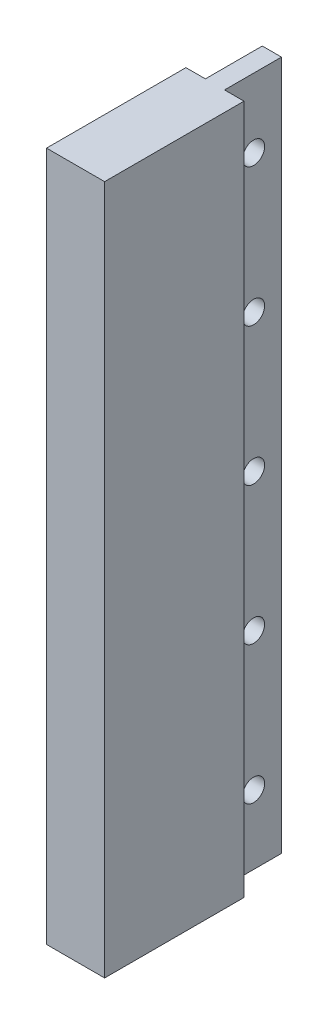
ISO-10303-21;
HEADER;
FILE_DESCRIPTION(('STEP AP214'),'2;1');
FILE_NAME('part.step','',(''),(''),'','','');
FILE_SCHEMA(('AUTOMOTIVE_DESIGN { 1 0 10303 214 1 1 1 1 }'));
ENDSEC;
DATA;
#1=APPLICATION_CONTEXT('core data for automotive mechanical design processes');
#2=APPLICATION_PROTOCOL_DEFINITION('international standard','automotive_design',2000,#1);
#3=PRODUCT_CONTEXT('',#1,'mechanical');
#4=PRODUCT('Part','Part','',(#3));
#5=PRODUCT_RELATED_PRODUCT_CATEGORY('part','',(#4));
#6=PRODUCT_DEFINITION_FORMATION('','',#4);
#7=PRODUCT_DEFINITION_CONTEXT('part definition',#1,'design');
#8=PRODUCT_DEFINITION('design','',#6,#7);
#9=PRODUCT_DEFINITION_SHAPE('','',#8);
#10=(LENGTH_UNIT() NAMED_UNIT(*) SI_UNIT(.MILLI.,.METRE.));
#11=(NAMED_UNIT(*) PLANE_ANGLE_UNIT() SI_UNIT($,.RADIAN.));
#12=(NAMED_UNIT(*) SI_UNIT($,.STERADIAN.) SOLID_ANGLE_UNIT());
#13=UNCERTAINTY_MEASURE_WITH_UNIT(LENGTH_MEASURE(1.E-05),#10,'distance_accuracy_value','');
#14=(GEOMETRIC_REPRESENTATION_CONTEXT(3) GLOBAL_UNCERTAINTY_ASSIGNED_CONTEXT((#13)) GLOBAL_UNIT_ASSIGNED_CONTEXT((#10,
#11,#12)) REPRESENTATION_CONTEXT('',''));
#15=CARTESIAN_POINT('',(0.,0.,0.));
#16=DIRECTION('',(0.,0.,1.));
#17=DIRECTION('',(1.,0.,0.));
#18=AXIS2_PLACEMENT_3D('',#15,#16,#17);
#19=CARTESIAN_POINT('',(0.00100000000000013,11.875,-5.00000000000001));
#20=DIRECTION('',(-1.,0.,0.));
#21=DIRECTION('',(0.,0.,1.));
#22=AXIS2_PLACEMENT_3D('',#19,#20,#21);
#23=CYLINDRICAL_SURFACE('',#22,1.9);
#24=CARTESIAN_POINT('',(-6.65,11.875,-5.00000000000001));
#25=DIRECTION('',(-1.,0.,0.));
#26=DIRECTION('',(0.,0.,1.));
#27=AXIS2_PLACEMENT_3D('',#24,#25,#26);
#28=CIRCLE('',#27,1.9);
#29=CARTESIAN_POINT('',(-6.65,11.875,-3.10000000000001));
#30=VERTEX_POINT('',#29);
#31=EDGE_CURVE('E55',#30,#30,#28,.T.);
#32=CARTESIAN_POINT('',(-3.35,11.875,-5.00000000000001));
#33=DIRECTION('',(-1.,0.,0.));
#34=DIRECTION('',(0.,0.,1.));
#35=AXIS2_PLACEMENT_3D('',#32,#33,#34);
#36=CIRCLE('',#35,1.9);
#37=CARTESIAN_POINT('',(-3.35,11.875,-3.10000000000001));
#38=VERTEX_POINT('',#37);
#39=EDGE_CURVE('E11',#38,#38,#36,.F.);
#40=CARTESIAN_POINT('',(-6.65,11.875,-3.10000000000001));
#41=CARTESIAN_POINT('',(-6.615625,11.875,-3.10000000000001));
#42=CARTESIAN_POINT('',(-6.58125,11.875,-3.10000000000001));
#43=CARTESIAN_POINT('',(-6.5125,11.875,-3.10000000000001));
#44=CARTESIAN_POINT('',(-6.478125,11.875,-3.10000000000001));
#45=CARTESIAN_POINT('',(-6.409375,11.875,-3.10000000000001));
#46=CARTESIAN_POINT('',(-6.375,11.875,-3.10000000000001));
#47=CARTESIAN_POINT('',(-6.30625,11.875,-3.10000000000001));
#48=CARTESIAN_POINT('',(-6.271875,11.875,-3.10000000000001));
#49=CARTESIAN_POINT('',(-6.203125,11.875,-3.10000000000001));
#50=CARTESIAN_POINT('',(-6.16875,11.875,-3.10000000000001));
#51=CARTESIAN_POINT('',(-6.1,11.875,-3.10000000000001));
#52=CARTESIAN_POINT('',(-6.065625,11.875,-3.10000000000001));
#53=CARTESIAN_POINT('',(-5.996875,11.875,-3.10000000000001));
#54=CARTESIAN_POINT('',(-5.9625,11.875,-3.10000000000001));
#55=CARTESIAN_POINT('',(-5.89375,11.875,-3.10000000000001));
#56=CARTESIAN_POINT('',(-5.859375,11.875,-3.10000000000001));
#57=CARTESIAN_POINT('',(-5.790625,11.875,-3.10000000000001));
#58=CARTESIAN_POINT('',(-5.75625,11.875,-3.10000000000001));
#59=CARTESIAN_POINT('',(-5.6875,11.875,-3.10000000000001));
#60=CARTESIAN_POINT('',(-5.653125,11.875,-3.10000000000001));
#61=CARTESIAN_POINT('',(-5.584375,11.875,-3.10000000000001));
#62=CARTESIAN_POINT('',(-5.55,11.875,-3.10000000000001));
#63=CARTESIAN_POINT('',(-5.48125,11.875,-3.10000000000001));
#64=CARTESIAN_POINT('',(-5.446875,11.875,-3.10000000000001));
#65=CARTESIAN_POINT('',(-5.378125,11.875,-3.10000000000001));
#66=CARTESIAN_POINT('',(-5.34375,11.875,-3.10000000000001));
#67=CARTESIAN_POINT('',(-5.275,11.875,-3.10000000000001));
#68=CARTESIAN_POINT('',(-5.240625,11.875,-3.10000000000001));
#69=CARTESIAN_POINT('',(-5.171875,11.875,-3.10000000000001));
#70=CARTESIAN_POINT('',(-5.1375,11.875,-3.10000000000001));
#71=CARTESIAN_POINT('',(-5.06875,11.875,-3.10000000000001));
#72=CARTESIAN_POINT('',(-5.034375,11.875,-3.10000000000001));
#73=CARTESIAN_POINT('',(-4.965625,11.875,-3.10000000000001));
#74=CARTESIAN_POINT('',(-4.93125,11.875,-3.10000000000001));
#75=CARTESIAN_POINT('',(-4.8625,11.875,-3.10000000000001));
#76=CARTESIAN_POINT('',(-4.828125,11.875,-3.10000000000001));
#77=CARTESIAN_POINT('',(-4.759375,11.875,-3.10000000000001));
#78=CARTESIAN_POINT('',(-4.725,11.875,-3.10000000000001));
#79=CARTESIAN_POINT('',(-4.65625,11.875,-3.10000000000001));
#80=CARTESIAN_POINT('',(-4.621875,11.875,-3.10000000000001));
#81=CARTESIAN_POINT('',(-4.553125,11.875,-3.10000000000001));
#82=CARTESIAN_POINT('',(-4.51875,11.875,-3.10000000000001));
#83=CARTESIAN_POINT('',(-4.45,11.875,-3.10000000000001));
#84=CARTESIAN_POINT('',(-4.415625,11.875,-3.10000000000001));
#85=CARTESIAN_POINT('',(-4.346875,11.875,-3.10000000000001));
#86=CARTESIAN_POINT('',(-4.3125,11.875,-3.10000000000001));
#87=CARTESIAN_POINT('',(-4.24375,11.875,-3.10000000000001));
#88=CARTESIAN_POINT('',(-4.209375,11.875,-3.10000000000001));
#89=CARTESIAN_POINT('',(-4.140625,11.875,-3.10000000000001));
#90=CARTESIAN_POINT('',(-4.10625,11.875,-3.10000000000001));
#91=CARTESIAN_POINT('',(-4.0375,11.875,-3.10000000000001));
#92=CARTESIAN_POINT('',(-4.003125,11.875,-3.10000000000001));
#93=CARTESIAN_POINT('',(-3.934375,11.875,-3.10000000000001));
#94=CARTESIAN_POINT('',(-3.9,11.875,-3.10000000000001));
#95=CARTESIAN_POINT('',(-3.83125,11.875,-3.10000000000001));
#96=CARTESIAN_POINT('',(-3.796875,11.875,-3.10000000000001));
#97=CARTESIAN_POINT('',(-3.728125,11.875,-3.10000000000001));
#98=CARTESIAN_POINT('',(-3.69375,11.875,-3.10000000000001));
#99=CARTESIAN_POINT('',(-3.625,11.875,-3.10000000000001));
#100=CARTESIAN_POINT('',(-3.590625,11.875,-3.10000000000001));
#101=CARTESIAN_POINT('',(-3.521875,11.875,-3.10000000000001));
#102=CARTESIAN_POINT('',(-3.4875,11.875,-3.10000000000001));
#103=CARTESIAN_POINT('',(-3.41875,11.875,-3.10000000000001));
#104=CARTESIAN_POINT('',(-3.384375,11.875,-3.10000000000001));
#105=CARTESIAN_POINT('',(-3.35,11.875,-3.10000000000001));
#106=B_SPLINE_CURVE_WITH_KNOTS('',3,(#40,#41,#42,#43,#44,#45,#46,#47,#48,#49,#50,#51,#52,#53,
#54,#55,#56,#57,#58,#59,#60,#61,#62,#63,#64,#65,#66,#67,#68,#69,#70,#71,#72,#73,#74,#75,#76,#77,
#78,#79,#80,#81,#82,#83,#84,#85,#86,#87,#88,#89,#90,#91,#92,#93,#94,#95,#96,#97,#98,#99,#100,
#101,#102,#103,#104,#105),.UNSPECIFIED.,.F.,.F.,(4,2,2,2,2,2,2,2,2,2,2,2,2,2,2,2,2,2,2,2,2,2,2,
2,2,2,2,2,2,2,2,2,4),(0.,0.103125,0.20625,0.309375,0.4125,0.515625,0.618749999999999,0.721875,
0.824999999999999,0.928125,1.03125,1.134375,1.2375,1.340625,1.44375,1.546875,1.65,1.753125,
1.85625,1.959375,2.0625,2.165625,2.26875,2.371875,2.475,2.578125,2.68125,2.784375,2.8875,
2.990625,3.09375,3.196875,3.3),.UNSPECIFIED.);
#107=EDGE_CURVE('BSEAM47',#30,#38,#106,.T.);
#108=ORIENTED_EDGE('',*,*,#31,.T.);
#109=ORIENTED_EDGE('',*,*,#39,.T.);
#110=ORIENTED_EDGE('',*,*,#107,.T.);
#111=ORIENTED_EDGE('',*,*,#107,.F.);
#112=EDGE_LOOP('',(#108,#110,#109,#111));
#113=FACE_BOUND('',#112,.T.);
#114=ADVANCED_FACE('F47',(#113),#23,.F.);
#115=CARTESIAN_POINT('',(0.00100000000000013,35.625,-5.00000000000001));
#116=DIRECTION('',(-1.,0.,0.));
#117=DIRECTION('',(0.,0.,1.));
#118=AXIS2_PLACEMENT_3D('',#115,#116,#117);
#119=CYLINDRICAL_SURFACE('',#118,1.9);
#120=CARTESIAN_POINT('',(-6.65,35.625,-5.00000000000001));
#121=DIRECTION('',(-1.,0.,0.));
#122=DIRECTION('',(0.,0.,1.));
#123=AXIS2_PLACEMENT_3D('',#120,#121,#122);
#124=CIRCLE('',#123,1.9);
#125=CARTESIAN_POINT('',(-6.65,35.625,-3.10000000000001));
#126=VERTEX_POINT('',#125);
#127=EDGE_CURVE('E217',#126,#126,#124,.T.);
#128=CARTESIAN_POINT('',(-3.35,35.625,-5.00000000000001));
#129=DIRECTION('',(-1.,0.,0.));
#130=DIRECTION('',(0.,0.,1.));
#131=AXIS2_PLACEMENT_3D('',#128,#129,#130);
#132=CIRCLE('',#131,1.9);
#133=CARTESIAN_POINT('',(-3.35,35.625,-3.10000000000001));
#134=VERTEX_POINT('',#133);
#135=EDGE_CURVE('E221',#134,#134,#132,.F.);
#136=CARTESIAN_POINT('',(-6.65,35.625,-3.10000000000001));
#137=CARTESIAN_POINT('',(-6.615625,35.625,-3.10000000000001));
#138=CARTESIAN_POINT('',(-6.58125,35.625,-3.10000000000001));
#139=CARTESIAN_POINT('',(-6.5125,35.625,-3.10000000000001));
#140=CARTESIAN_POINT('',(-6.478125,35.625,-3.10000000000001));
#141=CARTESIAN_POINT('',(-6.409375,35.625,-3.10000000000001));
#142=CARTESIAN_POINT('',(-6.375,35.625,-3.10000000000001));
#143=CARTESIAN_POINT('',(-6.30625,35.625,-3.10000000000001));
#144=CARTESIAN_POINT('',(-6.271875,35.625,-3.10000000000001));
#145=CARTESIAN_POINT('',(-6.203125,35.625,-3.10000000000001));
#146=CARTESIAN_POINT('',(-6.16875,35.625,-3.10000000000001));
#147=CARTESIAN_POINT('',(-6.1,35.625,-3.10000000000001));
#148=CARTESIAN_POINT('',(-6.065625,35.625,-3.10000000000001));
#149=CARTESIAN_POINT('',(-5.996875,35.625,-3.10000000000001));
#150=CARTESIAN_POINT('',(-5.9625,35.625,-3.10000000000001));
#151=CARTESIAN_POINT('',(-5.89375,35.625,-3.10000000000001));
#152=CARTESIAN_POINT('',(-5.859375,35.625,-3.10000000000001));
#153=CARTESIAN_POINT('',(-5.790625,35.625,-3.10000000000001));
#154=CARTESIAN_POINT('',(-5.75625,35.625,-3.10000000000001));
#155=CARTESIAN_POINT('',(-5.6875,35.625,-3.10000000000001));
#156=CARTESIAN_POINT('',(-5.653125,35.625,-3.10000000000001));
#157=CARTESIAN_POINT('',(-5.584375,35.625,-3.10000000000001));
#158=CARTESIAN_POINT('',(-5.55,35.625,-3.10000000000001));
#159=CARTESIAN_POINT('',(-5.48125,35.625,-3.10000000000001));
#160=CARTESIAN_POINT('',(-5.446875,35.625,-3.10000000000001));
#161=CARTESIAN_POINT('',(-5.378125,35.625,-3.10000000000001));
#162=CARTESIAN_POINT('',(-5.34375,35.625,-3.10000000000001));
#163=CARTESIAN_POINT('',(-5.275,35.625,-3.10000000000001));
#164=CARTESIAN_POINT('',(-5.240625,35.625,-3.10000000000001));
#165=CARTESIAN_POINT('',(-5.171875,35.625,-3.10000000000001));
#166=CARTESIAN_POINT('',(-5.1375,35.625,-3.10000000000001));
#167=CARTESIAN_POINT('',(-5.06875,35.625,-3.10000000000001));
#168=CARTESIAN_POINT('',(-5.034375,35.625,-3.10000000000001));
#169=CARTESIAN_POINT('',(-4.965625,35.625,-3.10000000000001));
#170=CARTESIAN_POINT('',(-4.93125,35.625,-3.10000000000001));
#171=CARTESIAN_POINT('',(-4.8625,35.625,-3.10000000000001));
#172=CARTESIAN_POINT('',(-4.828125,35.625,-3.10000000000001));
#173=CARTESIAN_POINT('',(-4.759375,35.625,-3.10000000000001));
#174=CARTESIAN_POINT('',(-4.725,35.625,-3.10000000000001));
#175=CARTESIAN_POINT('',(-4.65625,35.625,-3.10000000000001));
#176=CARTESIAN_POINT('',(-4.621875,35.625,-3.10000000000001));
#177=CARTESIAN_POINT('',(-4.553125,35.625,-3.10000000000001));
#178=CARTESIAN_POINT('',(-4.51875,35.625,-3.10000000000001));
#179=CARTESIAN_POINT('',(-4.45,35.625,-3.10000000000001));
#180=CARTESIAN_POINT('',(-4.415625,35.625,-3.10000000000001));
#181=CARTESIAN_POINT('',(-4.346875,35.625,-3.10000000000001));
#182=CARTESIAN_POINT('',(-4.3125,35.625,-3.10000000000001));
#183=CARTESIAN_POINT('',(-4.24375,35.625,-3.10000000000001));
#184=CARTESIAN_POINT('',(-4.209375,35.625,-3.10000000000001));
#185=CARTESIAN_POINT('',(-4.140625,35.625,-3.10000000000001));
#186=CARTESIAN_POINT('',(-4.10625,35.625,-3.10000000000001));
#187=CARTESIAN_POINT('',(-4.0375,35.625,-3.10000000000001));
#188=CARTESIAN_POINT('',(-4.003125,35.625,-3.10000000000001));
#189=CARTESIAN_POINT('',(-3.934375,35.625,-3.10000000000001));
#190=CARTESIAN_POINT('',(-3.9,35.625,-3.10000000000001));
#191=CARTESIAN_POINT('',(-3.83125,35.625,-3.10000000000001));
#192=CARTESIAN_POINT('',(-3.796875,35.625,-3.10000000000001));
#193=CARTESIAN_POINT('',(-3.728125,35.625,-3.10000000000001));
#194=CARTESIAN_POINT('',(-3.69375,35.625,-3.10000000000001));
#195=CARTESIAN_POINT('',(-3.625,35.625,-3.10000000000001));
#196=CARTESIAN_POINT('',(-3.590625,35.625,-3.10000000000001));
#197=CARTESIAN_POINT('',(-3.521875,35.625,-3.10000000000001));
#198=CARTESIAN_POINT('',(-3.4875,35.625,-3.10000000000001));
#199=CARTESIAN_POINT('',(-3.41875,35.625,-3.10000000000001));
#200=CARTESIAN_POINT('',(-3.384375,35.625,-3.10000000000001));
#201=CARTESIAN_POINT('',(-3.35,35.625,-3.10000000000001));
#202=B_SPLINE_CURVE_WITH_KNOTS('',3,(#136,#137,#138,#139,#140,#141,#142,#143,#144,#145,#146,
#147,#148,#149,#150,#151,#152,#153,#154,#155,#156,#157,#158,#159,#160,#161,#162,#163,#164,#165,
#166,#167,#168,#169,#170,#171,#172,#173,#174,#175,#176,#177,#178,#179,#180,#181,#182,#183,#184,
#185,#186,#187,#188,#189,#190,#191,#192,#193,#194,#195,#196,#197,#198,#199,#200,#201),
.UNSPECIFIED.,.F.,.F.,(4,2,2,2,2,2,2,2,2,2,2,2,2,2,2,2,2,2,2,2,2,2,2,2,2,2,2,2,2,2,2,2,4),(0.,
0.103125,0.20625,0.309375,0.4125,0.515625,0.618749999999999,0.721875,0.824999999999999,0.928125,
1.03125,1.134375,1.2375,1.340625,1.44375,1.546875,1.65,1.753125,1.85625,1.959375,2.0625,
2.165625,2.26875,2.371875,2.475,2.578125,2.68125,2.784375,2.8875,2.990625,3.09375,3.196875,3.3),.UNSPECIFIED.);
#203=EDGE_CURVE('BSEAM250',#126,#134,#202,.T.);
#204=ORIENTED_EDGE('',*,*,#127,.T.);
#205=ORIENTED_EDGE('',*,*,#135,.T.);
#206=ORIENTED_EDGE('',*,*,#203,.T.);
#207=ORIENTED_EDGE('',*,*,#203,.F.);
#208=EDGE_LOOP('',(#204,#206,#205,#207));
#209=FACE_BOUND('',#208,.T.);
#210=ADVANCED_FACE('F250',(#209),#119,.F.);
#211=CARTESIAN_POINT('',(0.00100000000000013,59.375,-5.00000000000001));
#212=DIRECTION('',(-1.,0.,0.));
#213=DIRECTION('',(0.,0.,1.));
#214=AXIS2_PLACEMENT_3D('',#211,#212,#213);
#215=CYLINDRICAL_SURFACE('',#214,1.9);
#216=CARTESIAN_POINT('',(-6.65,59.375,-5.00000000000001));
#217=DIRECTION('',(-1.,0.,0.));
#218=DIRECTION('',(0.,0.,1.));
#219=AXIS2_PLACEMENT_3D('',#216,#217,#218);
#220=CIRCLE('',#219,1.9);
#221=CARTESIAN_POINT('',(-6.65,59.375,-3.1));
#222=VERTEX_POINT('',#221);
#223=EDGE_CURVE('E200',#222,#222,#220,.T.);
#224=CARTESIAN_POINT('',(-3.35,59.375,-5.00000000000001));
#225=DIRECTION('',(-1.,0.,0.));
#226=DIRECTION('',(0.,0.,1.));
#227=AXIS2_PLACEMENT_3D('',#224,#225,#226);
#228=CIRCLE('',#227,1.9);
#229=CARTESIAN_POINT('',(-3.35,59.375,-3.1));
#230=VERTEX_POINT('',#229);
#231=EDGE_CURVE('E213',#230,#230,#228,.F.);
#232=CARTESIAN_POINT('',(-6.65,59.375,-3.1));
#233=CARTESIAN_POINT('',(-6.615625,59.375,-3.1));
#234=CARTESIAN_POINT('',(-6.58125,59.375,-3.1));
#235=CARTESIAN_POINT('',(-6.5125,59.375,-3.1));
#236=CARTESIAN_POINT('',(-6.478125,59.375,-3.1));
#237=CARTESIAN_POINT('',(-6.409375,59.375,-3.1));
#238=CARTESIAN_POINT('',(-6.375,59.375,-3.1));
#239=CARTESIAN_POINT('',(-6.30625,59.375,-3.1));
#240=CARTESIAN_POINT('',(-6.271875,59.375,-3.1));
#241=CARTESIAN_POINT('',(-6.203125,59.375,-3.1));
#242=CARTESIAN_POINT('',(-6.16875,59.375,-3.1));
#243=CARTESIAN_POINT('',(-6.1,59.375,-3.1));
#244=CARTESIAN_POINT('',(-6.065625,59.375,-3.1));
#245=CARTESIAN_POINT('',(-5.996875,59.375,-3.1));
#246=CARTESIAN_POINT('',(-5.9625,59.375,-3.1));
#247=CARTESIAN_POINT('',(-5.89375,59.375,-3.1));
#248=CARTESIAN_POINT('',(-5.859375,59.375,-3.1));
#249=CARTESIAN_POINT('',(-5.790625,59.375,-3.1));
#250=CARTESIAN_POINT('',(-5.75625,59.375,-3.1));
#251=CARTESIAN_POINT('',(-5.6875,59.375,-3.1));
#252=CARTESIAN_POINT('',(-5.653125,59.375,-3.1));
#253=CARTESIAN_POINT('',(-5.584375,59.375,-3.1));
#254=CARTESIAN_POINT('',(-5.55,59.375,-3.1));
#255=CARTESIAN_POINT('',(-5.48125,59.375,-3.1));
#256=CARTESIAN_POINT('',(-5.446875,59.375,-3.1));
#257=CARTESIAN_POINT('',(-5.378125,59.375,-3.1));
#258=CARTESIAN_POINT('',(-5.34375,59.375,-3.1));
#259=CARTESIAN_POINT('',(-5.275,59.375,-3.1));
#260=CARTESIAN_POINT('',(-5.240625,59.375,-3.1));
#261=CARTESIAN_POINT('',(-5.171875,59.375,-3.1));
#262=CARTESIAN_POINT('',(-5.1375,59.375,-3.1));
#263=CARTESIAN_POINT('',(-5.06875,59.375,-3.1));
#264=CARTESIAN_POINT('',(-5.034375,59.375,-3.1));
#265=CARTESIAN_POINT('',(-4.965625,59.375,-3.1));
#266=CARTESIAN_POINT('',(-4.93125,59.375,-3.1));
#267=CARTESIAN_POINT('',(-4.8625,59.375,-3.1));
#268=CARTESIAN_POINT('',(-4.828125,59.375,-3.1));
#269=CARTESIAN_POINT('',(-4.759375,59.375,-3.1));
#270=CARTESIAN_POINT('',(-4.725,59.375,-3.1));
#271=CARTESIAN_POINT('',(-4.65625,59.375,-3.1));
#272=CARTESIAN_POINT('',(-4.621875,59.375,-3.1));
#273=CARTESIAN_POINT('',(-4.553125,59.375,-3.1));
#274=CARTESIAN_POINT('',(-4.51875,59.375,-3.1));
#275=CARTESIAN_POINT('',(-4.45,59.375,-3.1));
#276=CARTESIAN_POINT('',(-4.415625,59.375,-3.1));
#277=CARTESIAN_POINT('',(-4.346875,59.375,-3.1));
#278=CARTESIAN_POINT('',(-4.3125,59.375,-3.1));
#279=CARTESIAN_POINT('',(-4.24375,59.375,-3.1));
#280=CARTESIAN_POINT('',(-4.209375,59.375,-3.1));
#281=CARTESIAN_POINT('',(-4.140625,59.375,-3.1));
#282=CARTESIAN_POINT('',(-4.10625,59.375,-3.1));
#283=CARTESIAN_POINT('',(-4.0375,59.375,-3.1));
#284=CARTESIAN_POINT('',(-4.003125,59.375,-3.1));
#285=CARTESIAN_POINT('',(-3.934375,59.375,-3.1));
#286=CARTESIAN_POINT('',(-3.9,59.375,-3.1));
#287=CARTESIAN_POINT('',(-3.83125,59.375,-3.1));
#288=CARTESIAN_POINT('',(-3.796875,59.375,-3.1));
#289=CARTESIAN_POINT('',(-3.728125,59.375,-3.1));
#290=CARTESIAN_POINT('',(-3.69375,59.375,-3.1));
#291=CARTESIAN_POINT('',(-3.625,59.375,-3.1));
#292=CARTESIAN_POINT('',(-3.590625,59.375,-3.1));
#293=CARTESIAN_POINT('',(-3.521875,59.375,-3.1));
#294=CARTESIAN_POINT('',(-3.4875,59.375,-3.1));
#295=CARTESIAN_POINT('',(-3.41875,59.375,-3.1));
#296=CARTESIAN_POINT('',(-3.384375,59.375,-3.1));
#297=CARTESIAN_POINT('',(-3.35,59.375,-3.1));
#298=B_SPLINE_CURVE_WITH_KNOTS('',3,(#232,#233,#234,#235,#236,#237,#238,#239,#240,#241,#242,
#243,#244,#245,#246,#247,#248,#249,#250,#251,#252,#253,#254,#255,#256,#257,#258,#259,#260,#261,
#262,#263,#264,#265,#266,#267,#268,#269,#270,#271,#272,#273,#274,#275,#276,#277,#278,#279,#280,
#281,#282,#283,#284,#285,#286,#287,#288,#289,#290,#291,#292,#293,#294,#295,#296,#297),
.UNSPECIFIED.,.F.,.F.,(4,2,2,2,2,2,2,2,2,2,2,2,2,2,2,2,2,2,2,2,2,2,2,2,2,2,2,2,2,2,2,2,4),(0.,
0.103125,0.20625,0.309375,0.4125,0.515625,0.618749999999999,0.721875,0.824999999999999,0.928125,
1.03125,1.134375,1.2375,1.340625,1.44375,1.546875,1.65,1.753125,1.85625,1.959375,2.0625,
2.165625,2.26875,2.371875,2.475,2.578125,2.68125,2.784375,2.8875,2.990625,3.09375,3.196875,3.3),.UNSPECIFIED.);
#299=EDGE_CURVE('BSEAM255',#222,#230,#298,.T.);
#300=ORIENTED_EDGE('',*,*,#223,.T.);
#301=ORIENTED_EDGE('',*,*,#231,.T.);
#302=ORIENTED_EDGE('',*,*,#299,.T.);
#303=ORIENTED_EDGE('',*,*,#299,.F.);
#304=EDGE_LOOP('',(#300,#302,#301,#303));
#305=FACE_BOUND('',#304,.T.);
#306=ADVANCED_FACE('F255',(#305),#215,.F.);
#307=CARTESIAN_POINT('',(-10.,0.,0.));
#308=DIRECTION('',(0.,0.,-1.));
#309=DIRECTION('',(-1.,0.,0.));
#310=AXIS2_PLACEMENT_3D('',#307,#308,#309);
#311=PLANE('',#310);
#312=DIRECTION('',(1.,0.,0.));
#313=VECTOR('',#312,1.);
#314=CARTESIAN_POINT('',(-10.,118.75,0.));
#315=LINE('',#314,#313);
#316=CARTESIAN_POINT('',(-10.,118.75,0.));
#317=VERTEX_POINT('',#316);
#318=CARTESIAN_POINT('',(-6.65,118.75,0.));
#319=VERTEX_POINT('',#318);
#320=EDGE_CURVE('E204',#317,#319,#315,.T.);
#321=ORIENTED_EDGE('',*,*,#320,.T.);
#322=DIRECTION('',(0.,-1.,0.));
#323=VECTOR('',#322,1.);
#324=CARTESIAN_POINT('',(-6.65,118.75,0.));
#325=LINE('',#324,#323);
#326=CARTESIAN_POINT('',(-6.65,0.,0.));
#327=VERTEX_POINT('',#326);
#328=EDGE_CURVE('E144',#319,#327,#325,.T.);
#329=ORIENTED_EDGE('',*,*,#328,.T.);
#330=DIRECTION('',(1.,0.,0.));
#331=VECTOR('',#330,1.);
#332=CARTESIAN_POINT('',(-10.,0.,0.));
#333=LINE('',#332,#331);
#334=CARTESIAN_POINT('',(-10.,0.,0.));
#335=VERTEX_POINT('',#334);
#336=EDGE_CURVE('E97',#335,#327,#333,.T.);
#337=ORIENTED_EDGE('',*,*,#336,.F.);
#338=DIRECTION('',(0.,1.,0.));
#339=VECTOR('',#338,1.);
#340=CARTESIAN_POINT('',(-10.,0.,0.));
#341=LINE('',#340,#339);
#342=EDGE_CURVE('E172',#335,#317,#341,.T.);
#343=ORIENTED_EDGE('',*,*,#342,.T.);
#344=EDGE_LOOP('',(#321,#329,#337,#343));
#345=FACE_BOUND('',#344,.T.);
#346=ADVANCED_FACE('F259',(#345),#311,.T.);
#347=CARTESIAN_POINT('',(-10.,0.,0.));
#348=DIRECTION('',(0.,-1.,0.));
#349=DIRECTION('',(0.,0.,-1.));
#350=AXIS2_PLACEMENT_3D('',#347,#348,#349);
#351=PLANE('',#350);
#352=DIRECTION('',(0.,0.,-1.));
#353=VECTOR('',#352,1.);
#354=CARTESIAN_POINT('',(0.,0.,0.));
#355=LINE('',#354,#353);
#356=CARTESIAN_POINT('',(0.,0.,24.));
#357=VERTEX_POINT('',#356);
#358=CARTESIAN_POINT('',(0.,0.,0.));
#359=VERTEX_POINT('',#358);
#360=EDGE_CURVE('E163',#357,#359,#355,.T.);
#361=ORIENTED_EDGE('',*,*,#360,.F.);
#362=DIRECTION('',(1.,0.,0.));
#363=VECTOR('',#362,1.);
#364=CARTESIAN_POINT('',(-10.,0.,24.));
#365=LINE('',#364,#363);
#366=CARTESIAN_POINT('',(-10.,0.,24.));
#367=VERTEX_POINT('',#366);
#368=EDGE_CURVE('E71',#367,#357,#365,.T.);
#369=ORIENTED_EDGE('',*,*,#368,.F.);
#370=DIRECTION('',(0.,0.,-1.));
#371=VECTOR('',#370,1.);
#372=CARTESIAN_POINT('',(-10.,0.,0.));
#373=LINE('',#372,#371);
#374=EDGE_CURVE('E169',#367,#335,#373,.T.);
#375=ORIENTED_EDGE('',*,*,#374,.T.);
#376=ORIENTED_EDGE('',*,*,#336,.T.);
#377=DIRECTION('',(0.,0.,-1.));
#378=VECTOR('',#377,1.);
#379=CARTESIAN_POINT('',(-6.65,0.,0.));
#380=LINE('',#379,#378);
#381=CARTESIAN_POINT('',(-6.65,0.,-9.8));
#382=VERTEX_POINT('',#381);
#383=EDGE_CURVE('E62',#327,#382,#380,.T.);
#384=ORIENTED_EDGE('',*,*,#383,.T.);
#385=DIRECTION('',(1.,0.,0.));
#386=VECTOR('',#385,1.);
#387=CARTESIAN_POINT('',(0.,0.,-9.8));
#388=LINE('',#387,#386);
#389=CARTESIAN_POINT('',(-3.35,0.,-9.8));
#390=VERTEX_POINT('',#389);
#391=EDGE_CURVE('E126',#382,#390,#388,.T.);
#392=ORIENTED_EDGE('',*,*,#391,.T.);
#393=DIRECTION('',(0.,0.,-1.));
#394=VECTOR('',#393,1.);
#395=CARTESIAN_POINT('',(-3.35,0.,0.));
#396=LINE('',#395,#394);
#397=CARTESIAN_POINT('',(-3.35,0.,0.));
#398=VERTEX_POINT('',#397);
#399=EDGE_CURVE('E146',#398,#390,#396,.T.);
#400=ORIENTED_EDGE('',*,*,#399,.F.);
#401=EDGE_CURVE('E183',#398,#359,#333,.T.);
#402=ORIENTED_EDGE('',*,*,#401,.T.);
#403=EDGE_LOOP('',(#361,#369,#375,#376,#384,#392,#400,#402));
#404=FACE_BOUND('',#403,.T.);
#405=ADVANCED_FACE('F264',(#404),#351,.T.);
#406=CARTESIAN_POINT('',(-10.,0.,24.));
#407=DIRECTION('',(0.,0.,1.));
#408=DIRECTION('',(1.,0.,0.));
#409=AXIS2_PLACEMENT_3D('',#406,#407,#408);
#410=PLANE('',#409);
#411=DIRECTION('',(0.,-1.,0.));
#412=VECTOR('',#411,1.);
#413=CARTESIAN_POINT('',(0.,0.,24.));
#414=LINE('',#413,#412);
#415=CARTESIAN_POINT('',(0.,118.75,24.));
#416=VERTEX_POINT('',#415);
#417=EDGE_CURVE('E173',#416,#357,#414,.T.);
#418=ORIENTED_EDGE('',*,*,#417,.F.);
#419=DIRECTION('',(1.,0.,0.));
#420=VECTOR('',#419,1.);
#421=CARTESIAN_POINT('',(-10.,118.75,24.));
#422=LINE('',#421,#420);
#423=CARTESIAN_POINT('',(-10.,118.75,24.));
#424=VERTEX_POINT('',#423);
#425=EDGE_CURVE('E201',#424,#416,#422,.T.);
#426=ORIENTED_EDGE('',*,*,#425,.F.);
#427=DIRECTION('',(0.,-1.,0.));
#428=VECTOR('',#427,1.);
#429=CARTESIAN_POINT('',(-10.,0.,24.));
#430=LINE('',#429,#428);
#431=EDGE_CURVE('E180',#424,#367,#430,.T.);
#432=ORIENTED_EDGE('',*,*,#431,.T.);
#433=ORIENTED_EDGE('',*,*,#368,.T.);
#434=EDGE_LOOP('',(#418,#426,#432,#433));
#435=FACE_BOUND('',#434,.T.);
#436=ADVANCED_FACE('F267',(#435),#410,.T.);
#437=CARTESIAN_POINT('',(-10.,118.75,0.));
#438=DIRECTION('',(0.,1.,0.));
#439=DIRECTION('',(0.,0.,1.));
#440=AXIS2_PLACEMENT_3D('',#437,#438,#439);
#441=PLANE('',#440);
#442=DIRECTION('',(0.,0.,1.));
#443=VECTOR('',#442,1.);
#444=CARTESIAN_POINT('',(0.,118.75,0.));
#445=LINE('',#444,#443);
#446=CARTESIAN_POINT('',(0.,118.75,0.));
#447=VERTEX_POINT('',#446);
#448=EDGE_CURVE('E191',#447,#416,#445,.T.);
#449=ORIENTED_EDGE('',*,*,#448,.F.);
#450=CARTESIAN_POINT('',(-3.35,118.75,0.));
#451=VERTEX_POINT('',#450);
#452=EDGE_CURVE('E207',#451,#447,#315,.T.);
#453=ORIENTED_EDGE('',*,*,#452,.F.);
#454=DIRECTION('',(0.,0.,-1.));
#455=VECTOR('',#454,1.);
#456=CARTESIAN_POINT('',(-3.35,118.75,0.));
#457=LINE('',#456,#455);
#458=CARTESIAN_POINT('',(-3.35,118.75,-9.79999999999999));
#459=VERTEX_POINT('',#458);
#460=EDGE_CURVE('E130',#451,#459,#457,.T.);
#461=ORIENTED_EDGE('',*,*,#460,.T.);
#462=DIRECTION('',(1.,0.,0.));
#463=VECTOR('',#462,1.);
#464=CARTESIAN_POINT('',(0.,118.75,-9.79999999999999));
#465=LINE('',#464,#463);
#466=CARTESIAN_POINT('',(-6.65,118.75,-9.79999999999999));
#467=VERTEX_POINT('',#466);
#468=EDGE_CURVE('E124',#467,#459,#465,.T.);
#469=ORIENTED_EDGE('',*,*,#468,.F.);
#470=DIRECTION('',(0.,0.,-1.));
#471=VECTOR('',#470,1.);
#472=CARTESIAN_POINT('',(-6.65,118.75,0.));
#473=LINE('',#472,#471);
#474=EDGE_CURVE('E136',#319,#467,#473,.T.);
#475=ORIENTED_EDGE('',*,*,#474,.F.);
#476=ORIENTED_EDGE('',*,*,#320,.F.);
#477=DIRECTION('',(0.,0.,1.));
#478=VECTOR('',#477,1.);
#479=CARTESIAN_POINT('',(-10.,118.75,0.));
#480=LINE('',#479,#478);
#481=EDGE_CURVE('E176',#317,#424,#480,.T.);
#482=ORIENTED_EDGE('',*,*,#481,.T.);
#483=ORIENTED_EDGE('',*,*,#425,.T.);
#484=EDGE_LOOP('',(#449,#453,#461,#469,#475,#476,#482,#483));
#485=FACE_BOUND('',#484,.T.);
#486=ADVANCED_FACE('F135',(#485),#441,.T.);
#487=DIRECTION('',(0.,-1.,0.));
#488=VECTOR('',#487,1.);
#489=CARTESIAN_POINT('',(-3.35,118.75,0.));
#490=LINE('',#489,#488);
#491=EDGE_CURVE('E164',#451,#398,#490,.T.);
#492=ORIENTED_EDGE('',*,*,#491,.F.);
#493=ORIENTED_EDGE('',*,*,#452,.T.);
#494=DIRECTION('',(0.,1.,0.));
#495=VECTOR('',#494,1.);
#496=CARTESIAN_POINT('',(0.,0.,0.));
#497=LINE('',#496,#495);
#498=EDGE_CURVE('E187',#359,#447,#497,.T.);
#499=ORIENTED_EDGE('',*,*,#498,.F.);
#500=ORIENTED_EDGE('',*,*,#401,.F.);
#501=EDGE_LOOP('',(#492,#493,#499,#500));
#502=FACE_BOUND('',#501,.T.);
#503=ADVANCED_FACE('F268',(#502),#311,.T.);
#504=CARTESIAN_POINT('',(-10.,0.,0.));
#505=DIRECTION('',(-1.,0.,0.));
#506=DIRECTION('',(0.,0.,1.));
#507=AXIS2_PLACEMENT_3D('',#504,#505,#506);
#508=PLANE('',#507);
#509=ORIENTED_EDGE('',*,*,#374,.F.);
#510=ORIENTED_EDGE('',*,*,#431,.F.);
#511=ORIENTED_EDGE('',*,*,#481,.F.);
#512=ORIENTED_EDGE('',*,*,#342,.F.);
#513=EDGE_LOOP('',(#509,#510,#511,#512));
#514=FACE_BOUND('',#513,.T.);
#515=ADVANCED_FACE('F242',(#514),#508,.T.);
#516=CARTESIAN_POINT('',(0.,0.,0.));
#517=DIRECTION('',(-1.,0.,0.));
#518=DIRECTION('',(0.,0.,1.));
#519=AXIS2_PLACEMENT_3D('',#516,#517,#518);
#520=PLANE('',#519);
#521=ORIENTED_EDGE('',*,*,#360,.T.);
#522=ORIENTED_EDGE('',*,*,#498,.T.);
#523=ORIENTED_EDGE('',*,*,#448,.T.);
#524=ORIENTED_EDGE('',*,*,#417,.T.);
#525=EDGE_LOOP('',(#521,#522,#523,#524));
#526=FACE_BOUND('',#525,.T.);
#527=ADVANCED_FACE('F232',(#526),#520,.F.);
#528=CARTESIAN_POINT('',(-6.65,118.75,0.));
#529=DIRECTION('',(-1.,0.,0.));
#530=DIRECTION('',(0.,0.,1.));
#531=AXIS2_PLACEMENT_3D('',#528,#529,#530);
#532=PLANE('',#531);
#533=CARTESIAN_POINT('',(-6.65,83.125,-5.));
#534=DIRECTION('',(-1.,0.,0.));
#535=DIRECTION('',(0.,0.,1.));
#536=AXIS2_PLACEMENT_3D('',#533,#534,#535);
#537=CIRCLE('',#536,1.9);
#538=CARTESIAN_POINT('',(-6.65,83.125,-3.1));
#539=VERTEX_POINT('',#538);
#540=EDGE_CURVE('E376',#539,#539,#537,.T.);
#541=ORIENTED_EDGE('',*,*,#540,.F.);
#542=EDGE_LOOP('',(#541));
#543=FACE_BOUND('',#542,.T.);
#544=CARTESIAN_POINT('',(-6.65,106.875,-5.));
#545=DIRECTION('',(-1.,0.,0.));
#546=DIRECTION('',(0.,0.,1.));
#547=AXIS2_PLACEMENT_3D('',#544,#545,#546);
#548=CIRCLE('',#547,1.9);
#549=CARTESIAN_POINT('',(-6.65,106.875,-3.1));
#550=VERTEX_POINT('',#549);
#551=EDGE_CURVE('E381',#550,#550,#548,.T.);
#552=ORIENTED_EDGE('',*,*,#551,.F.);
#553=EDGE_LOOP('',(#552));
#554=FACE_BOUND('',#553,.T.);
#555=ORIENTED_EDGE('',*,*,#383,.F.);
#556=ORIENTED_EDGE('',*,*,#328,.F.);
#557=ORIENTED_EDGE('',*,*,#474,.T.);
#558=DIRECTION('',(0.,-1.,0.));
#559=VECTOR('',#558,1.);
#560=CARTESIAN_POINT('',(-6.65,118.75,-9.79999999999999));
#561=LINE('',#560,#559);
#562=EDGE_CURVE('E121',#467,#382,#561,.T.);
#563=ORIENTED_EDGE('',*,*,#562,.T.);
#564=EDGE_LOOP('',(#555,#556,#557,#563));
#565=FACE_BOUND('',#564,.T.);
#566=ORIENTED_EDGE('',*,*,#223,.F.);
#567=EDGE_LOOP('',(#566));
#568=FACE_BOUND('',#567,.T.);
#569=ORIENTED_EDGE('',*,*,#127,.F.);
#570=EDGE_LOOP('',(#569));
#571=FACE_BOUND('',#570,.T.);
#572=ORIENTED_EDGE('',*,*,#31,.F.);
#573=EDGE_LOOP('',(#572));
#574=FACE_BOUND('',#573,.T.);
#575=ADVANCED_FACE('F142',(#543,#554,#565,#568,#571,#574),#532,.T.);
#576=CARTESIAN_POINT('',(-3.35,118.75,0.));
#577=DIRECTION('',(-1.,0.,0.));
#578=DIRECTION('',(0.,0.,1.));
#579=AXIS2_PLACEMENT_3D('',#576,#577,#578);
#580=PLANE('',#579);
#581=CARTESIAN_POINT('',(-3.35,83.125,-5.));
#582=DIRECTION('',(-1.,0.,0.));
#583=DIRECTION('',(0.,0.,1.));
#584=AXIS2_PLACEMENT_3D('',#581,#582,#583);
#585=CIRCLE('',#584,1.9);
#586=CARTESIAN_POINT('',(-3.35,83.125,-3.1));
#587=VERTEX_POINT('',#586);
#588=EDGE_CURVE('E379',#587,#587,#585,.F.);
#589=ORIENTED_EDGE('',*,*,#588,.F.);
#590=EDGE_LOOP('',(#589));
#591=FACE_BOUND('',#590,.T.);
#592=CARTESIAN_POINT('',(-3.35,106.875,-5.));
#593=DIRECTION('',(-1.,0.,0.));
#594=DIRECTION('',(0.,0.,1.));
#595=AXIS2_PLACEMENT_3D('',#592,#593,#594);
#596=CIRCLE('',#595,1.9);
#597=CARTESIAN_POINT('',(-3.35,106.875,-3.1));
#598=VERTEX_POINT('',#597);
#599=EDGE_CURVE('E152',#598,#598,#596,.F.);
#600=ORIENTED_EDGE('',*,*,#599,.F.);
#601=EDGE_LOOP('',(#600));
#602=FACE_BOUND('',#601,.T.);
#603=ORIENTED_EDGE('',*,*,#399,.T.);
#604=DIRECTION('',(0.,-1.,0.));
#605=VECTOR('',#604,1.);
#606=CARTESIAN_POINT('',(-3.35,118.75,-9.79999999999999));
#607=LINE('',#606,#605);
#608=EDGE_CURVE('E129',#459,#390,#607,.T.);
#609=ORIENTED_EDGE('',*,*,#608,.F.);
#610=ORIENTED_EDGE('',*,*,#460,.F.);
#611=ORIENTED_EDGE('',*,*,#491,.T.);
#612=EDGE_LOOP('',(#603,#609,#610,#611));
#613=FACE_BOUND('',#612,.T.);
#614=ORIENTED_EDGE('',*,*,#231,.F.);
#615=EDGE_LOOP('',(#614));
#616=FACE_BOUND('',#615,.T.);
#617=ORIENTED_EDGE('',*,*,#135,.F.);
#618=EDGE_LOOP('',(#617));
#619=FACE_BOUND('',#618,.T.);
#620=ORIENTED_EDGE('',*,*,#39,.F.);
#621=EDGE_LOOP('',(#620));
#622=FACE_BOUND('',#621,.T.);
#623=ADVANCED_FACE('F231',(#591,#602,#613,#616,#619,#622),#580,.F.);
#624=CARTESIAN_POINT('',(0.,118.75,-9.79999999999999));
#625=DIRECTION('',(0.,0.,-1.));
#626=DIRECTION('',(0.,1.,0.));
#627=AXIS2_PLACEMENT_3D('',#624,#625,#626);
#628=PLANE('',#627);
#629=ORIENTED_EDGE('',*,*,#391,.F.);
#630=ORIENTED_EDGE('',*,*,#562,.F.);
#631=ORIENTED_EDGE('',*,*,#468,.T.);
#632=ORIENTED_EDGE('',*,*,#608,.T.);
#633=EDGE_LOOP('',(#629,#630,#631,#632));
#634=FACE_BOUND('',#633,.T.);
#635=ADVANCED_FACE('F123',(#634),#628,.T.);
#636=CARTESIAN_POINT('',(0.00100000000000013,106.875,-5.));
#637=DIRECTION('',(-1.,0.,0.));
#638=DIRECTION('',(0.,0.,1.));
#639=AXIS2_PLACEMENT_3D('',#636,#637,#638);
#640=CYLINDRICAL_SURFACE('',#639,1.9);
#641=CARTESIAN_POINT('',(-6.65,106.875,-3.1));
#642=CARTESIAN_POINT('',(-6.615625,106.875,-3.1));
#643=CARTESIAN_POINT('',(-6.58125,106.875,-3.1));
#644=CARTESIAN_POINT('',(-6.5125,106.875,-3.1));
#645=CARTESIAN_POINT('',(-6.478125,106.875,-3.1));
#646=CARTESIAN_POINT('',(-6.409375,106.875,-3.1));
#647=CARTESIAN_POINT('',(-6.375,106.875,-3.1));
#648=CARTESIAN_POINT('',(-6.30625,106.875,-3.1));
#649=CARTESIAN_POINT('',(-6.271875,106.875,-3.1));
#650=CARTESIAN_POINT('',(-6.203125,106.875,-3.1));
#651=CARTESIAN_POINT('',(-6.16875,106.875,-3.1));
#652=CARTESIAN_POINT('',(-6.1,106.875,-3.1));
#653=CARTESIAN_POINT('',(-6.065625,106.875,-3.1));
#654=CARTESIAN_POINT('',(-5.996875,106.875,-3.1));
#655=CARTESIAN_POINT('',(-5.9625,106.875,-3.1));
#656=CARTESIAN_POINT('',(-5.89375,106.875,-3.1));
#657=CARTESIAN_POINT('',(-5.859375,106.875,-3.1));
#658=CARTESIAN_POINT('',(-5.790625,106.875,-3.1));
#659=CARTESIAN_POINT('',(-5.75625,106.875,-3.1));
#660=CARTESIAN_POINT('',(-5.6875,106.875,-3.1));
#661=CARTESIAN_POINT('',(-5.653125,106.875,-3.1));
#662=CARTESIAN_POINT('',(-5.584375,106.875,-3.1));
#663=CARTESIAN_POINT('',(-5.55,106.875,-3.1));
#664=CARTESIAN_POINT('',(-5.48125,106.875,-3.1));
#665=CARTESIAN_POINT('',(-5.446875,106.875,-3.1));
#666=CARTESIAN_POINT('',(-5.378125,106.875,-3.1));
#667=CARTESIAN_POINT('',(-5.34375,106.875,-3.1));
#668=CARTESIAN_POINT('',(-5.275,106.875,-3.1));
#669=CARTESIAN_POINT('',(-5.240625,106.875,-3.1));
#670=CARTESIAN_POINT('',(-5.171875,106.875,-3.1));
#671=CARTESIAN_POINT('',(-5.1375,106.875,-3.1));
#672=CARTESIAN_POINT('',(-5.06875,106.875,-3.1));
#673=CARTESIAN_POINT('',(-5.034375,106.875,-3.1));
#674=CARTESIAN_POINT('',(-4.965625,106.875,-3.1));
#675=CARTESIAN_POINT('',(-4.93125,106.875,-3.1));
#676=CARTESIAN_POINT('',(-4.8625,106.875,-3.1));
#677=CARTESIAN_POINT('',(-4.828125,106.875,-3.1));
#678=CARTESIAN_POINT('',(-4.759375,106.875,-3.1));
#679=CARTESIAN_POINT('',(-4.725,106.875,-3.1));
#680=CARTESIAN_POINT('',(-4.65625,106.875,-3.1));
#681=CARTESIAN_POINT('',(-4.621875,106.875,-3.1));
#682=CARTESIAN_POINT('',(-4.553125,106.875,-3.1));
#683=CARTESIAN_POINT('',(-4.51875,106.875,-3.1));
#684=CARTESIAN_POINT('',(-4.45,106.875,-3.1));
#685=CARTESIAN_POINT('',(-4.415625,106.875,-3.1));
#686=CARTESIAN_POINT('',(-4.346875,106.875,-3.1));
#687=CARTESIAN_POINT('',(-4.3125,106.875,-3.1));
#688=CARTESIAN_POINT('',(-4.24375,106.875,-3.1));
#689=CARTESIAN_POINT('',(-4.209375,106.875,-3.1));
#690=CARTESIAN_POINT('',(-4.140625,106.875,-3.1));
#691=CARTESIAN_POINT('',(-4.10625,106.875,-3.1));
#692=CARTESIAN_POINT('',(-4.0375,106.875,-3.1));
#693=CARTESIAN_POINT('',(-4.003125,106.875,-3.1));
#694=CARTESIAN_POINT('',(-3.934375,106.875,-3.1));
#695=CARTESIAN_POINT('',(-3.9,106.875,-3.1));
#696=CARTESIAN_POINT('',(-3.83125,106.875,-3.1));
#697=CARTESIAN_POINT('',(-3.796875,106.875,-3.1));
#698=CARTESIAN_POINT('',(-3.728125,106.875,-3.1));
#699=CARTESIAN_POINT('',(-3.69375,106.875,-3.1));
#700=CARTESIAN_POINT('',(-3.625,106.875,-3.1));
#701=CARTESIAN_POINT('',(-3.590625,106.875,-3.1));
#702=CARTESIAN_POINT('',(-3.521875,106.875,-3.1));
#703=CARTESIAN_POINT('',(-3.4875,106.875,-3.1));
#704=CARTESIAN_POINT('',(-3.41875,106.875,-3.1));
#705=CARTESIAN_POINT('',(-3.384375,106.875,-3.1));
#706=CARTESIAN_POINT('',(-3.35,106.875,-3.1));
#707=B_SPLINE_CURVE_WITH_KNOTS('',3,(#641,#642,#643,#644,#645,#646,#647,#648,#649,#650,#651,
#652,#653,#654,#655,#656,#657,#658,#659,#660,#661,#662,#663,#664,#665,#666,#667,#668,#669,#670,
#671,#672,#673,#674,#675,#676,#677,#678,#679,#680,#681,#682,#683,#684,#685,#686,#687,#688,#689,
#690,#691,#692,#693,#694,#695,#696,#697,#698,#699,#700,#701,#702,#703,#704,#705,#706),
.UNSPECIFIED.,.F.,.F.,(4,2,2,2,2,2,2,2,2,2,2,2,2,2,2,2,2,2,2,2,2,2,2,2,2,2,2,2,2,2,2,2,4),(0.,
0.103125,0.20625,0.309375,0.4125,0.515625,0.618749999999999,0.721875,0.824999999999999,0.928125,
1.03125,1.134375,1.2375,1.340625,1.44375,1.546875,1.65,1.753125,1.85625,1.959375,2.0625,
2.165625,2.26875,2.371875,2.475,2.578125,2.68125,2.784375,2.8875,2.990625,3.09375,3.196875,3.3),.UNSPECIFIED.);
#708=EDGE_CURVE('BSEAM323',#550,#598,#707,.T.);
#709=ORIENTED_EDGE('',*,*,#551,.T.);
#710=ORIENTED_EDGE('',*,*,#599,.T.);
#711=ORIENTED_EDGE('',*,*,#708,.T.);
#712=ORIENTED_EDGE('',*,*,#708,.F.);
#713=EDGE_LOOP('',(#709,#711,#710,#712));
#714=FACE_BOUND('',#713,.T.);
#715=ADVANCED_FACE('F323',(#714),#640,.F.);
#716=CARTESIAN_POINT('',(0.00100000000000013,83.125,-5.));
#717=DIRECTION('',(-1.,0.,0.));
#718=DIRECTION('',(0.,0.,1.));
#719=AXIS2_PLACEMENT_3D('',#716,#717,#718);
#720=CYLINDRICAL_SURFACE('',#719,1.9);
#721=CARTESIAN_POINT('',(-6.65,83.125,-3.1));
#722=CARTESIAN_POINT('',(-6.615625,83.125,-3.1));
#723=CARTESIAN_POINT('',(-6.58125,83.125,-3.1));
#724=CARTESIAN_POINT('',(-6.5125,83.125,-3.1));
#725=CARTESIAN_POINT('',(-6.478125,83.125,-3.1));
#726=CARTESIAN_POINT('',(-6.409375,83.125,-3.1));
#727=CARTESIAN_POINT('',(-6.375,83.125,-3.1));
#728=CARTESIAN_POINT('',(-6.30625,83.125,-3.1));
#729=CARTESIAN_POINT('',(-6.271875,83.125,-3.1));
#730=CARTESIAN_POINT('',(-6.203125,83.125,-3.1));
#731=CARTESIAN_POINT('',(-6.16875,83.125,-3.1));
#732=CARTESIAN_POINT('',(-6.1,83.125,-3.1));
#733=CARTESIAN_POINT('',(-6.065625,83.125,-3.1));
#734=CARTESIAN_POINT('',(-5.996875,83.125,-3.1));
#735=CARTESIAN_POINT('',(-5.9625,83.125,-3.1));
#736=CARTESIAN_POINT('',(-5.89375,83.125,-3.1));
#737=CARTESIAN_POINT('',(-5.859375,83.125,-3.1));
#738=CARTESIAN_POINT('',(-5.790625,83.125,-3.1));
#739=CARTESIAN_POINT('',(-5.75625,83.125,-3.1));
#740=CARTESIAN_POINT('',(-5.6875,83.125,-3.1));
#741=CARTESIAN_POINT('',(-5.653125,83.125,-3.1));
#742=CARTESIAN_POINT('',(-5.584375,83.125,-3.1));
#743=CARTESIAN_POINT('',(-5.55,83.125,-3.1));
#744=CARTESIAN_POINT('',(-5.48125,83.125,-3.1));
#745=CARTESIAN_POINT('',(-5.446875,83.125,-3.1));
#746=CARTESIAN_POINT('',(-5.378125,83.125,-3.1));
#747=CARTESIAN_POINT('',(-5.34375,83.125,-3.1));
#748=CARTESIAN_POINT('',(-5.275,83.125,-3.1));
#749=CARTESIAN_POINT('',(-5.240625,83.125,-3.1));
#750=CARTESIAN_POINT('',(-5.171875,83.125,-3.1));
#751=CARTESIAN_POINT('',(-5.1375,83.125,-3.1));
#752=CARTESIAN_POINT('',(-5.06875,83.125,-3.1));
#753=CARTESIAN_POINT('',(-5.034375,83.125,-3.1));
#754=CARTESIAN_POINT('',(-4.965625,83.125,-3.1));
#755=CARTESIAN_POINT('',(-4.93125,83.125,-3.1));
#756=CARTESIAN_POINT('',(-4.8625,83.125,-3.1));
#757=CARTESIAN_POINT('',(-4.828125,83.125,-3.1));
#758=CARTESIAN_POINT('',(-4.759375,83.125,-3.1));
#759=CARTESIAN_POINT('',(-4.725,83.125,-3.1));
#760=CARTESIAN_POINT('',(-4.65625,83.125,-3.1));
#761=CARTESIAN_POINT('',(-4.621875,83.125,-3.1));
#762=CARTESIAN_POINT('',(-4.553125,83.125,-3.1));
#763=CARTESIAN_POINT('',(-4.51875,83.125,-3.1));
#764=CARTESIAN_POINT('',(-4.45,83.125,-3.1));
#765=CARTESIAN_POINT('',(-4.415625,83.125,-3.1));
#766=CARTESIAN_POINT('',(-4.346875,83.125,-3.1));
#767=CARTESIAN_POINT('',(-4.3125,83.125,-3.1));
#768=CARTESIAN_POINT('',(-4.24375,83.125,-3.1));
#769=CARTESIAN_POINT('',(-4.209375,83.125,-3.1));
#770=CARTESIAN_POINT('',(-4.140625,83.125,-3.1));
#771=CARTESIAN_POINT('',(-4.10625,83.125,-3.1));
#772=CARTESIAN_POINT('',(-4.0375,83.125,-3.1));
#773=CARTESIAN_POINT('',(-4.003125,83.125,-3.1));
#774=CARTESIAN_POINT('',(-3.934375,83.125,-3.1));
#775=CARTESIAN_POINT('',(-3.9,83.125,-3.1));
#776=CARTESIAN_POINT('',(-3.83125,83.125,-3.1));
#777=CARTESIAN_POINT('',(-3.796875,83.125,-3.1));
#778=CARTESIAN_POINT('',(-3.728125,83.125,-3.1));
#779=CARTESIAN_POINT('',(-3.69375,83.125,-3.1));
#780=CARTESIAN_POINT('',(-3.625,83.125,-3.1));
#781=CARTESIAN_POINT('',(-3.590625,83.125,-3.1));
#782=CARTESIAN_POINT('',(-3.521875,83.125,-3.1));
#783=CARTESIAN_POINT('',(-3.4875,83.125,-3.1));
#784=CARTESIAN_POINT('',(-3.41875,83.125,-3.1));
#785=CARTESIAN_POINT('',(-3.384375,83.125,-3.1));
#786=CARTESIAN_POINT('',(-3.35,83.125,-3.1));
#787=B_SPLINE_CURVE_WITH_KNOTS('',3,(#721,#722,#723,#724,#725,#726,#727,#728,#729,#730,#731,
#732,#733,#734,#735,#736,#737,#738,#739,#740,#741,#742,#743,#744,#745,#746,#747,#748,#749,#750,
#751,#752,#753,#754,#755,#756,#757,#758,#759,#760,#761,#762,#763,#764,#765,#766,#767,#768,#769,
#770,#771,#772,#773,#774,#775,#776,#777,#778,#779,#780,#781,#782,#783,#784,#785,#786),
.UNSPECIFIED.,.F.,.F.,(4,2,2,2,2,2,2,2,2,2,2,2,2,2,2,2,2,2,2,2,2,2,2,2,2,2,2,2,2,2,2,2,4),(0.,
0.103125,0.20625,0.309375,0.4125,0.515625,0.618749999999999,0.721875,0.824999999999999,0.928125,
1.03125,1.134375,1.2375,1.340625,1.44375,1.546875,1.65,1.753125,1.85625,1.959375,2.0625,
2.165625,2.26875,2.371875,2.475,2.578125,2.68125,2.784375,2.8875,2.990625,3.09375,3.196875,3.3),.UNSPECIFIED.);
#788=EDGE_CURVE('BSEAM330',#539,#587,#787,.T.);
#789=ORIENTED_EDGE('',*,*,#540,.T.);
#790=ORIENTED_EDGE('',*,*,#588,.T.);
#791=ORIENTED_EDGE('',*,*,#788,.T.);
#792=ORIENTED_EDGE('',*,*,#788,.F.);
#793=EDGE_LOOP('',(#789,#791,#790,#792));
#794=FACE_BOUND('',#793,.T.);
#795=ADVANCED_FACE('F330',(#794),#720,.F.);
#796=CLOSED_SHELL('',(#114,#210,#306,#346,#405,#436,#486,#503,#515,#527,#575,#623,#635,#715,#795));
#797=MANIFOLD_SOLID_BREP('B2',#796);
#798=ADVANCED_BREP_SHAPE_REPRESENTATION('',(#18,#797),#14);
#799=SHAPE_DEFINITION_REPRESENTATION(#9,#798);
ENDSEC;
END-ISO-10303-21;
